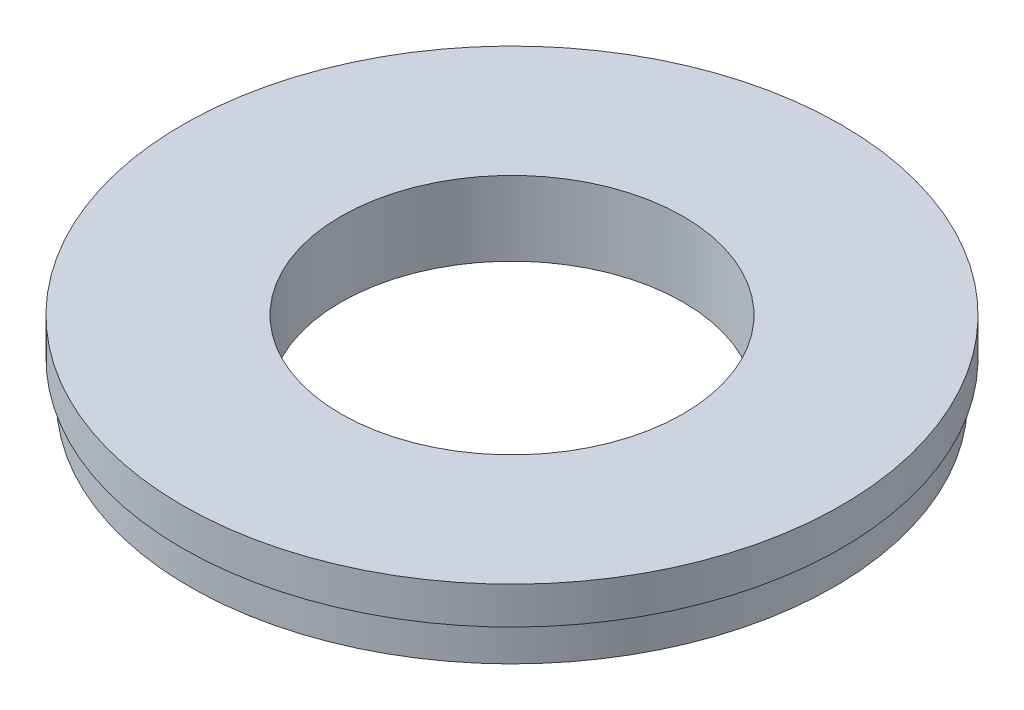
ISO-10303-21;
HEADER;
FILE_DESCRIPTION(('STEP AP214'),'2;1');
FILE_NAME('part.step','',(''),(''),'','','');
FILE_SCHEMA(('AUTOMOTIVE_DESIGN { 1 0 10303 214 1 1 1 1 }'));
ENDSEC;
DATA;
#1=APPLICATION_CONTEXT('core data for automotive mechanical design processes');
#2=APPLICATION_PROTOCOL_DEFINITION('international standard','automotive_design',2000,#1);
#3=PRODUCT_CONTEXT('',#1,'mechanical');
#4=PRODUCT('Part','Part','',(#3));
#5=PRODUCT_RELATED_PRODUCT_CATEGORY('part','',(#4));
#6=PRODUCT_DEFINITION_FORMATION('','',#4);
#7=PRODUCT_DEFINITION_CONTEXT('part definition',#1,'design');
#8=PRODUCT_DEFINITION('design','',#6,#7);
#9=PRODUCT_DEFINITION_SHAPE('','',#8);
#10=(LENGTH_UNIT() NAMED_UNIT(*) SI_UNIT(.MILLI.,.METRE.));
#11=(NAMED_UNIT(*) PLANE_ANGLE_UNIT() SI_UNIT($,.RADIAN.));
#12=(NAMED_UNIT(*) SI_UNIT($,.STERADIAN.) SOLID_ANGLE_UNIT());
#13=UNCERTAINTY_MEASURE_WITH_UNIT(LENGTH_MEASURE(1.E-05),#10,'distance_accuracy_value','');
#14=(GEOMETRIC_REPRESENTATION_CONTEXT(3) GLOBAL_UNCERTAINTY_ASSIGNED_CONTEXT((#13)) GLOBAL_UNIT_ASSIGNED_CONTEXT((#10,
#11,#12)) REPRESENTATION_CONTEXT('',''));
#15=CARTESIAN_POINT('',(0.,0.,0.));
#16=DIRECTION('',(0.,0.,1.));
#17=DIRECTION('',(1.,0.,0.));
#18=AXIS2_PLACEMENT_3D('',#15,#16,#17);
#19=CARTESIAN_POINT('',(52.959,5.969,0.));
#20=DIRECTION('',(0.,-1.,0.));
#21=DIRECTION('',(0.,0.,-1.));
#22=AXIS2_PLACEMENT_3D('',#19,#20,#21);
#23=PLANE('',#22);
#24=CARTESIAN_POINT('',(0.,5.969,0.));
#25=DIRECTION('',(0.,-1.,0.));
#26=DIRECTION('',(0.,0.,-1.));
#27=AXIS2_PLACEMENT_3D('',#24,#25,#26);
#28=CIRCLE('',#27,52.959);
#29=CARTESIAN_POINT('',(0.,5.969,-52.959));
#30=VERTEX_POINT('',#29);
#31=EDGE_CURVE('E10',#30,#30,#28,.T.);
#32=ORIENTED_EDGE('',*,*,#31,.T.);
#33=EDGE_LOOP('',(#32));
#34=FACE_BOUND('',#33,.T.);
#35=CARTESIAN_POINT('',(0.,5.969,0.));
#36=DIRECTION('',(0.,-1.,0.));
#37=DIRECTION('',(0.,0.,-1.));
#38=AXIS2_PLACEMENT_3D('',#35,#36,#37);
#39=CIRCLE('',#38,51.7652);
#40=CARTESIAN_POINT('',(0.,5.969,-51.7652));
#41=VERTEX_POINT('',#40);
#42=EDGE_CURVE('E54',#41,#41,#39,.T.);
#43=ORIENTED_EDGE('',*,*,#42,.F.);
#44=EDGE_LOOP('',(#43));
#45=FACE_BOUND('',#44,.T.);
#46=ADVANCED_FACE('F32',(#34,#45),#23,.T.);
#47=CARTESIAN_POINT('',(0.,0.,0.));
#48=DIRECTION('',(0.,-1.,0.));
#49=DIRECTION('',(0.,0.,-1.));
#50=AXIS2_PLACEMENT_3D('',#47,#48,#49);
#51=CYLINDRICAL_SURFACE('',#50,52.959);
#52=CARTESIAN_POINT('',(0.,11.938,0.));
#53=DIRECTION('',(0.,-1.,0.));
#54=DIRECTION('',(0.,0.,-1.));
#55=AXIS2_PLACEMENT_3D('',#52,#53,#54);
#56=CIRCLE('',#55,52.959);
#57=CARTESIAN_POINT('',(0.,11.938,-52.959));
#58=VERTEX_POINT('',#57);
#59=EDGE_CURVE('E38',#58,#58,#56,.T.);
#60=ORIENTED_EDGE('',*,*,#59,.T.);
#61=EDGE_LOOP('',(#60));
#62=FACE_BOUND('',#61,.T.);
#63=ORIENTED_EDGE('',*,*,#31,.F.);
#64=EDGE_LOOP('',(#63));
#65=FACE_BOUND('',#64,.T.);
#66=ADVANCED_FACE('F62',(#62,#65),#51,.T.);
#67=CARTESIAN_POINT('',(27.5,11.938,0.));
#68=DIRECTION('',(0.,1.,0.));
#69=DIRECTION('',(0.,0.,1.));
#70=AXIS2_PLACEMENT_3D('',#67,#68,#69);
#71=PLANE('',#70);
#72=CARTESIAN_POINT('',(0.,11.938,0.));
#73=DIRECTION('',(0.,-1.,0.));
#74=DIRECTION('',(0.,0.,-1.));
#75=AXIS2_PLACEMENT_3D('',#72,#73,#74);
#76=CIRCLE('',#75,27.5);
#77=CARTESIAN_POINT('',(0.,11.938,-27.5));
#78=VERTEX_POINT('',#77);
#79=EDGE_CURVE('E42',#78,#78,#76,.T.);
#80=ORIENTED_EDGE('',*,*,#79,.T.);
#81=EDGE_LOOP('',(#80));
#82=FACE_BOUND('',#81,.T.);
#83=ORIENTED_EDGE('',*,*,#59,.F.);
#84=EDGE_LOOP('',(#83));
#85=FACE_BOUND('',#84,.T.);
#86=ADVANCED_FACE('F66',(#82,#85),#71,.T.);
#87=CARTESIAN_POINT('',(0.,0.,0.));
#88=DIRECTION('',(0.,-1.,0.));
#89=DIRECTION('',(0.,0.,-1.));
#90=AXIS2_PLACEMENT_3D('',#87,#88,#89);
#91=CYLINDRICAL_SURFACE('',#90,27.5);
#92=CARTESIAN_POINT('',(0.,0.,0.));
#93=DIRECTION('',(0.,-1.,0.));
#94=DIRECTION('',(0.,0.,-1.));
#95=AXIS2_PLACEMENT_3D('',#92,#93,#94);
#96=CIRCLE('',#95,27.5);
#97=CARTESIAN_POINT('',(0.,0.,-27.5));
#98=VERTEX_POINT('',#97);
#99=EDGE_CURVE('E46',#98,#98,#96,.T.);
#100=ORIENTED_EDGE('',*,*,#99,.T.);
#101=EDGE_LOOP('',(#100));
#102=FACE_BOUND('',#101,.T.);
#103=ORIENTED_EDGE('',*,*,#79,.F.);
#104=EDGE_LOOP('',(#103));
#105=FACE_BOUND('',#104,.T.);
#106=ADVANCED_FACE('F70',(#102,#105),#91,.F.);
#107=CARTESIAN_POINT('',(27.5,0.,0.));
#108=DIRECTION('',(0.,-1.,0.));
#109=DIRECTION('',(0.,0.,-1.));
#110=AXIS2_PLACEMENT_3D('',#107,#108,#109);
#111=PLANE('',#110);
#112=CARTESIAN_POINT('',(0.,0.,0.));
#113=DIRECTION('',(0.,-1.,0.));
#114=DIRECTION('',(0.,0.,-1.));
#115=AXIS2_PLACEMENT_3D('',#112,#113,#114);
#116=CIRCLE('',#115,51.7652);
#117=CARTESIAN_POINT('',(0.,0.,-51.7652));
#118=VERTEX_POINT('',#117);
#119=EDGE_CURVE('E51',#118,#118,#116,.T.);
#120=ORIENTED_EDGE('',*,*,#119,.T.);
#121=EDGE_LOOP('',(#120));
#122=FACE_BOUND('',#121,.T.);
#123=ORIENTED_EDGE('',*,*,#99,.F.);
#124=EDGE_LOOP('',(#123));
#125=FACE_BOUND('',#124,.T.);
#126=ADVANCED_FACE('F77',(#122,#125),#111,.T.);
#127=CARTESIAN_POINT('',(0.,0.,0.));
#128=DIRECTION('',(0.,-1.,0.));
#129=DIRECTION('',(0.,0.,-1.));
#130=AXIS2_PLACEMENT_3D('',#127,#128,#129);
#131=CYLINDRICAL_SURFACE('',#130,51.7652);
#132=ORIENTED_EDGE('',*,*,#42,.T.);
#133=EDGE_LOOP('',(#132));
#134=FACE_BOUND('',#133,.T.);
#135=ORIENTED_EDGE('',*,*,#119,.F.);
#136=EDGE_LOOP('',(#135));
#137=FACE_BOUND('',#136,.T.);
#138=ADVANCED_FACE('F58',(#134,#137),#131,.T.);
#139=CLOSED_SHELL('',(#46,#66,#86,#106,#126,#138));
#140=MANIFOLD_SOLID_BREP('B2',#139);
#141=ADVANCED_BREP_SHAPE_REPRESENTATION('',(#18,#140),#14);
#142=SHAPE_DEFINITION_REPRESENTATION(#9,#141);
ENDSEC;
END-ISO-10303-21;
